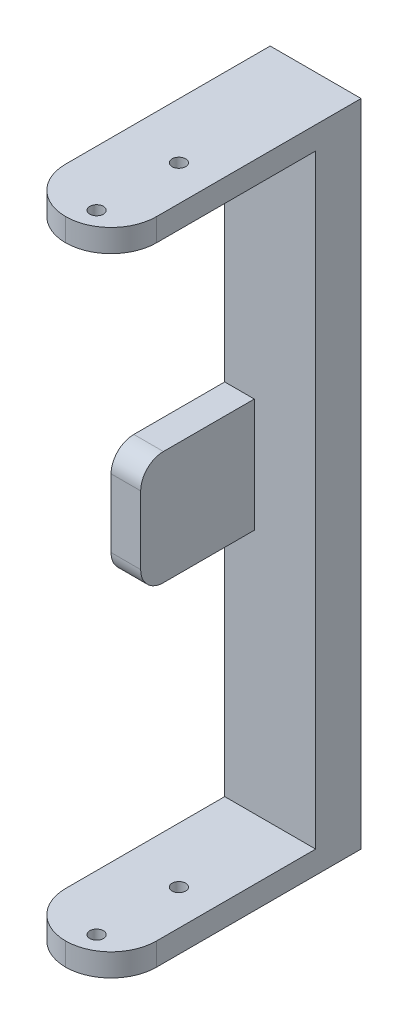
ISO-10303-21;
HEADER;
FILE_DESCRIPTION(('STEP AP214'),'2;1');
FILE_NAME('part.step','',(''),(''),'','','');
FILE_SCHEMA(('AUTOMOTIVE_DESIGN { 1 0 10303 214 1 1 1 1 }'));
ENDSEC;
DATA;
#1=APPLICATION_CONTEXT('core data for automotive mechanical design processes');
#2=APPLICATION_PROTOCOL_DEFINITION('international standard','automotive_design',2000,#1);
#3=PRODUCT_CONTEXT('',#1,'mechanical');
#4=PRODUCT('Part','Part','',(#3));
#5=PRODUCT_RELATED_PRODUCT_CATEGORY('part','',(#4));
#6=PRODUCT_DEFINITION_FORMATION('','',#4);
#7=PRODUCT_DEFINITION_CONTEXT('part definition',#1,'design');
#8=PRODUCT_DEFINITION('design','',#6,#7);
#9=PRODUCT_DEFINITION_SHAPE('','',#8);
#10=(LENGTH_UNIT() NAMED_UNIT(*) SI_UNIT(.MILLI.,.METRE.));
#11=(NAMED_UNIT(*) PLANE_ANGLE_UNIT() SI_UNIT($,.RADIAN.));
#12=(NAMED_UNIT(*) SI_UNIT($,.STERADIAN.) SOLID_ANGLE_UNIT());
#13=UNCERTAINTY_MEASURE_WITH_UNIT(LENGTH_MEASURE(1.E-05),#10,'distance_accuracy_value','');
#14=(GEOMETRIC_REPRESENTATION_CONTEXT(3) GLOBAL_UNCERTAINTY_ASSIGNED_CONTEXT((#13)) GLOBAL_UNIT_ASSIGNED_CONTEXT((#10,
#11,#12)) REPRESENTATION_CONTEXT('',''));
#15=CARTESIAN_POINT('',(0.,0.,0.));
#16=DIRECTION('',(0.,0.,1.));
#17=DIRECTION('',(1.,0.,0.));
#18=AXIS2_PLACEMENT_3D('',#15,#16,#17);
#19=CARTESIAN_POINT('',(0.,0.,10.));
#20=DIRECTION('',(0.,0.,1.));
#21=DIRECTION('',(1.,0.,0.));
#22=AXIS2_PLACEMENT_3D('',#19,#20,#21);
#23=PLANE('',#22);
#24=DIRECTION('',(0.,-1.,0.));
#25=VECTOR('',#24,1.);
#26=CARTESIAN_POINT('',(-20.,71.5,10.));
#27=LINE('',#26,#25);
#28=CARTESIAN_POINT('',(-20.,66.5,10.));
#29=VERTEX_POINT('',#28);
#30=CARTESIAN_POINT('',(-20.,12.5,10.));
#31=VERTEX_POINT('',#30);
#32=EDGE_CURVE('E220',#29,#31,#27,.T.);
#33=ORIENTED_EDGE('',*,*,#32,.T.);
#34=DIRECTION('',(-1.,0.,0.));
#35=VECTOR('',#34,1.);
#36=CARTESIAN_POINT('',(0.,12.5,10.));
#37=LINE('',#36,#35);
#38=CARTESIAN_POINT('',(-13.49,12.5,10.));
#39=VERTEX_POINT('',#38);
#40=EDGE_CURVE('E168',#39,#31,#37,.T.);
#41=ORIENTED_EDGE('',*,*,#40,.F.);
#42=DIRECTION('',(0.,-1.,0.));
#43=VECTOR('',#42,1.);
#44=CARTESIAN_POINT('',(-13.49,0.,10.));
#45=LINE('',#44,#43);
#46=CARTESIAN_POINT('',(-13.49,-12.5,10.));
#47=VERTEX_POINT('',#46);
#48=EDGE_CURVE('E152',#39,#47,#45,.T.);
#49=ORIENTED_EDGE('',*,*,#48,.T.);
#50=DIRECTION('',(-1.,0.,0.));
#51=VECTOR('',#50,1.);
#52=CARTESIAN_POINT('',(0.,-12.5,10.));
#53=LINE('',#52,#51);
#54=CARTESIAN_POINT('',(-20.,-12.5,10.));
#55=VERTEX_POINT('',#54);
#56=EDGE_CURVE('E165',#47,#55,#53,.T.);
#57=ORIENTED_EDGE('',*,*,#56,.T.);
#58=CARTESIAN_POINT('',(-20.,-66.5,10.));
#59=VERTEX_POINT('',#58);
#60=EDGE_CURVE('E223',#55,#59,#27,.T.);
#61=ORIENTED_EDGE('',*,*,#60,.T.);
#62=DIRECTION('',(1.,0.,0.));
#63=VECTOR('',#62,1.);
#64=CARTESIAN_POINT('',(0.,-66.5,10.));
#65=LINE('',#64,#63);
#66=CARTESIAN_POINT('',(0.,-66.5,10.));
#67=VERTEX_POINT('',#66);
#68=EDGE_CURVE('E203',#59,#67,#65,.T.);
#69=ORIENTED_EDGE('',*,*,#68,.T.);
#70=DIRECTION('',(0.,1.,0.));
#71=VECTOR('',#70,1.);
#72=CARTESIAN_POINT('',(0.,71.5,10.));
#73=LINE('',#72,#71);
#74=CARTESIAN_POINT('',(0.,66.5,10.));
#75=VERTEX_POINT('',#74);
#76=EDGE_CURVE('E222',#67,#75,#73,.T.);
#77=ORIENTED_EDGE('',*,*,#76,.T.);
#78=DIRECTION('',(1.,0.,0.));
#79=VECTOR('',#78,1.);
#80=CARTESIAN_POINT('',(0.,66.5,10.));
#81=LINE('',#80,#79);
#82=EDGE_CURVE('E212',#29,#75,#81,.T.);
#83=ORIENTED_EDGE('',*,*,#82,.F.);
#84=EDGE_LOOP('',(#33,#41,#49,#57,#61,#69,#77,#83));
#85=FACE_BOUND('',#84,.T.);
#86=ADVANCED_FACE('F35',(#85),#23,.T.);
#87=CARTESIAN_POINT('',(-20.,71.5,10.));
#88=DIRECTION('',(1.,0.,0.));
#89=DIRECTION('',(0.,0.,-1.));
#90=AXIS2_PLACEMENT_3D('',#87,#88,#89);
#91=PLANE('',#90);
#92=DIRECTION('',(0.,0.,-1.));
#93=VECTOR('',#92,1.);
#94=CARTESIAN_POINT('',(-20.,-12.5,35.));
#95=LINE('',#94,#93);
#96=CARTESIAN_POINT('',(-20.,-12.5,30.));
#97=VERTEX_POINT('',#96);
#98=EDGE_CURVE('E158',#97,#55,#95,.T.);
#99=ORIENTED_EDGE('',*,*,#98,.F.);
#100=CARTESIAN_POINT('',(-20.,-7.5,30.));
#101=DIRECTION('',(1.,0.,0.));
#102=DIRECTION('',(0.,0.,-1.));
#103=AXIS2_PLACEMENT_3D('',#100,#101,#102);
#104=CIRCLE('',#103,5.);
#105=CARTESIAN_POINT('',(-20.,-7.5,35.));
#106=VERTEX_POINT('',#105);
#107=EDGE_CURVE('E283',#97,#106,#104,.F.);
#108=ORIENTED_EDGE('',*,*,#107,.T.);
#109=DIRECTION('',(0.,-1.,0.));
#110=VECTOR('',#109,1.);
#111=CARTESIAN_POINT('',(-20.,0.,35.));
#112=LINE('',#111,#110);
#113=CARTESIAN_POINT('',(-20.,7.5,35.));
#114=VERTEX_POINT('',#113);
#115=EDGE_CURVE('E159',#114,#106,#112,.T.);
#116=ORIENTED_EDGE('',*,*,#115,.F.);
#117=CARTESIAN_POINT('',(-20.,7.5,30.));
#118=DIRECTION('',(1.,0.,0.));
#119=DIRECTION('',(0.,0.,-1.));
#120=AXIS2_PLACEMENT_3D('',#117,#118,#119);
#121=CIRCLE('',#120,5.);
#122=CARTESIAN_POINT('',(-20.,12.5,30.));
#123=VERTEX_POINT('',#122);
#124=EDGE_CURVE('E281',#114,#123,#121,.F.);
#125=ORIENTED_EDGE('',*,*,#124,.T.);
#126=DIRECTION('',(0.,0.,-1.));
#127=VECTOR('',#126,1.);
#128=CARTESIAN_POINT('',(-20.,12.5,35.));
#129=LINE('',#128,#127);
#130=EDGE_CURVE('E178',#123,#31,#129,.T.);
#131=ORIENTED_EDGE('',*,*,#130,.T.);
#132=ORIENTED_EDGE('',*,*,#32,.F.);
#133=DIRECTION('',(0.,0.,-1.));
#134=VECTOR('',#133,1.);
#135=CARTESIAN_POINT('',(-20.,66.5,55.));
#136=LINE('',#135,#134);
#137=CARTESIAN_POINT('',(-20.,66.5,45.));
#138=VERTEX_POINT('',#137);
#139=EDGE_CURVE('E217',#138,#29,#136,.T.);
#140=ORIENTED_EDGE('',*,*,#139,.F.);
#141=DIRECTION('',(0.,-1.,0.));
#142=VECTOR('',#141,1.);
#143=CARTESIAN_POINT('',(-20.,71.5,45.));
#144=LINE('',#143,#142);
#145=CARTESIAN_POINT('',(-20.,71.5,45.));
#146=VERTEX_POINT('',#145);
#147=EDGE_CURVE('E258',#138,#146,#144,.F.);
#148=ORIENTED_EDGE('',*,*,#147,.T.);
#149=DIRECTION('',(0.,0.,-1.));
#150=VECTOR('',#149,1.);
#151=CARTESIAN_POINT('',(-20.,71.5,10.));
#152=LINE('',#151,#150);
#153=CARTESIAN_POINT('',(-20.,71.5,0.));
#154=VERTEX_POINT('',#153);
#155=EDGE_CURVE('E226',#146,#154,#152,.T.);
#156=ORIENTED_EDGE('',*,*,#155,.T.);
#157=DIRECTION('',(0.,-1.,0.));
#158=VECTOR('',#157,1.);
#159=CARTESIAN_POINT('',(-20.,71.5,0.));
#160=LINE('',#159,#158);
#161=CARTESIAN_POINT('',(-20.,-71.5,0.));
#162=VERTEX_POINT('',#161);
#163=EDGE_CURVE('E219',#154,#162,#160,.T.);
#164=ORIENTED_EDGE('',*,*,#163,.T.);
#165=DIRECTION('',(0.,0.,-1.));
#166=VECTOR('',#165,1.);
#167=CARTESIAN_POINT('',(-20.,-71.5,10.));
#168=LINE('',#167,#166);
#169=CARTESIAN_POINT('',(-20.,-71.5,45.));
#170=VERTEX_POINT('',#169);
#171=EDGE_CURVE('E243',#170,#162,#168,.T.);
#172=ORIENTED_EDGE('',*,*,#171,.F.);
#173=DIRECTION('',(0.,-1.,0.));
#174=VECTOR('',#173,1.);
#175=CARTESIAN_POINT('',(-20.,-66.5,45.));
#176=LINE('',#175,#174);
#177=CARTESIAN_POINT('',(-20.,-66.5,45.));
#178=VERTEX_POINT('',#177);
#179=EDGE_CURVE('E261',#170,#178,#176,.F.);
#180=ORIENTED_EDGE('',*,*,#179,.T.);
#181=DIRECTION('',(0.,0.,-1.));
#182=VECTOR('',#181,1.);
#183=CARTESIAN_POINT('',(-20.,-66.5,55.));
#184=LINE('',#183,#182);
#185=EDGE_CURVE('E209',#178,#59,#184,.T.);
#186=ORIENTED_EDGE('',*,*,#185,.T.);
#187=ORIENTED_EDGE('',*,*,#60,.F.);
#188=EDGE_LOOP('',(#99,#108,#116,#125,#131,#132,#140,#148,#156,#164,#172,#180,#186,#187));
#189=FACE_BOUND('',#188,.T.);
#190=ADVANCED_FACE('F296',(#189),#91,.F.);
#191=CARTESIAN_POINT('',(-20.,-71.5,10.));
#192=DIRECTION('',(0.,1.,0.));
#193=DIRECTION('',(0.,0.,1.));
#194=AXIS2_PLACEMENT_3D('',#191,#192,#193);
#195=PLANE('',#194);
#196=CARTESIAN_POINT('',(-7.80000000000008,-71.5,32.2835836967569));
#197=DIRECTION('',(0.,1.,0.));
#198=DIRECTION('',(0.,0.,1.));
#199=AXIS2_PLACEMENT_3D('',#196,#197,#198);
#200=CIRCLE('',#199,1.5);
#201=CARTESIAN_POINT('',(-7.80000000000008,-71.5,33.7835836967569));
#202=VERTEX_POINT('',#201);
#203=EDGE_CURVE('E183',#202,#202,#200,.T.);
#204=ORIENTED_EDGE('',*,*,#203,.T.);
#205=EDGE_LOOP('',(#204));
#206=FACE_BOUND('',#205,.T.);
#207=CARTESIAN_POINT('',(-7.80000000000009,-71.5,50.383583696757));
#208=DIRECTION('',(0.,1.,0.));
#209=DIRECTION('',(0.,0.,1.));
#210=AXIS2_PLACEMENT_3D('',#207,#208,#209);
#211=CIRCLE('',#210,1.5);
#212=CARTESIAN_POINT('',(-7.80000000000009,-71.5,51.883583696757));
#213=VERTEX_POINT('',#212);
#214=EDGE_CURVE('E190',#213,#213,#211,.T.);
#215=ORIENTED_EDGE('',*,*,#214,.T.);
#216=EDGE_LOOP('',(#215));
#217=FACE_BOUND('',#216,.T.);
#218=DIRECTION('',(0.,0.,-1.));
#219=VECTOR('',#218,1.);
#220=CARTESIAN_POINT('',(0.,-71.5,10.));
#221=LINE('',#220,#219);
#222=CARTESIAN_POINT('',(0.,-71.5,45.));
#223=VERTEX_POINT('',#222);
#224=CARTESIAN_POINT('',(0.,-71.5,0.));
#225=VERTEX_POINT('',#224);
#226=EDGE_CURVE('E241',#223,#225,#221,.T.);
#227=ORIENTED_EDGE('',*,*,#226,.F.);
#228=CARTESIAN_POINT('',(-10.,-71.5,45.));
#229=DIRECTION('',(0.,1.,0.));
#230=DIRECTION('',(0.,0.,1.));
#231=AXIS2_PLACEMENT_3D('',#228,#229,#230);
#232=CIRCLE('',#231,10.);
#233=CARTESIAN_POINT('',(-10.,-71.5,55.));
#234=VERTEX_POINT('',#233);
#235=EDGE_CURVE('E256',#223,#234,#232,.F.);
#236=ORIENTED_EDGE('',*,*,#235,.T.);
#237=CARTESIAN_POINT('',(-10.,-71.5,45.));
#238=DIRECTION('',(0.,1.,0.));
#239=DIRECTION('',(0.,0.,1.));
#240=AXIS2_PLACEMENT_3D('',#237,#238,#239);
#241=CIRCLE('',#240,10.);
#242=EDGE_CURVE('E254',#234,#170,#241,.F.);
#243=ORIENTED_EDGE('',*,*,#242,.T.);
#244=ORIENTED_EDGE('',*,*,#171,.T.);
#245=DIRECTION('',(1.,0.,0.));
#246=VECTOR('',#245,1.);
#247=CARTESIAN_POINT('',(-20.,-71.5,0.));
#248=LINE('',#247,#246);
#249=EDGE_CURVE('E229',#162,#225,#248,.T.);
#250=ORIENTED_EDGE('',*,*,#249,.T.);
#251=EDGE_LOOP('',(#227,#236,#243,#244,#250));
#252=FACE_BOUND('',#251,.T.);
#253=ADVANCED_FACE('F313',(#206,#217,#252),#195,.F.);
#254=CARTESIAN_POINT('',(0.,71.5,10.));
#255=DIRECTION('',(-1.,0.,0.));
#256=DIRECTION('',(0.,0.,1.));
#257=AXIS2_PLACEMENT_3D('',#254,#255,#256);
#258=PLANE('',#257);
#259=DIRECTION('',(0.,0.,-1.));
#260=VECTOR('',#259,1.);
#261=CARTESIAN_POINT('',(0.,-66.5,55.));
#262=LINE('',#261,#260);
#263=CARTESIAN_POINT('',(0.,-66.5,45.));
#264=VERTEX_POINT('',#263);
#265=EDGE_CURVE('E206',#264,#67,#262,.T.);
#266=ORIENTED_EDGE('',*,*,#265,.F.);
#267=DIRECTION('',(0.,1.,0.));
#268=VECTOR('',#267,1.);
#269=CARTESIAN_POINT('',(0.,-71.5,45.));
#270=LINE('',#269,#268);
#271=EDGE_CURVE('E251',#264,#223,#270,.F.);
#272=ORIENTED_EDGE('',*,*,#271,.T.);
#273=ORIENTED_EDGE('',*,*,#226,.T.);
#274=DIRECTION('',(0.,1.,0.));
#275=VECTOR('',#274,1.);
#276=CARTESIAN_POINT('',(0.,71.5,0.));
#277=LINE('',#276,#275);
#278=CARTESIAN_POINT('',(0.,71.5,0.));
#279=VERTEX_POINT('',#278);
#280=EDGE_CURVE('E232',#225,#279,#277,.T.);
#281=ORIENTED_EDGE('',*,*,#280,.T.);
#282=DIRECTION('',(0.,0.,-1.));
#283=VECTOR('',#282,1.);
#284=CARTESIAN_POINT('',(0.,71.5,10.));
#285=LINE('',#284,#283);
#286=CARTESIAN_POINT('',(0.,71.5,45.));
#287=VERTEX_POINT('',#286);
#288=EDGE_CURVE('E239',#287,#279,#285,.T.);
#289=ORIENTED_EDGE('',*,*,#288,.F.);
#290=DIRECTION('',(0.,1.,0.));
#291=VECTOR('',#290,1.);
#292=CARTESIAN_POINT('',(0.,66.5,45.));
#293=LINE('',#292,#291);
#294=CARTESIAN_POINT('',(0.,66.5,45.));
#295=VERTEX_POINT('',#294);
#296=EDGE_CURVE('E249',#287,#295,#293,.F.);
#297=ORIENTED_EDGE('',*,*,#296,.T.);
#298=DIRECTION('',(0.,0.,-1.));
#299=VECTOR('',#298,1.);
#300=CARTESIAN_POINT('',(0.,66.5,55.));
#301=LINE('',#300,#299);
#302=EDGE_CURVE('E215',#295,#75,#301,.T.);
#303=ORIENTED_EDGE('',*,*,#302,.T.);
#304=ORIENTED_EDGE('',*,*,#76,.F.);
#305=EDGE_LOOP('',(#266,#272,#273,#281,#289,#297,#303,#304));
#306=FACE_BOUND('',#305,.T.);
#307=ADVANCED_FACE('F326',(#306),#258,.F.);
#308=CARTESIAN_POINT('',(-20.,71.5,10.));
#309=DIRECTION('',(0.,-1.,0.));
#310=DIRECTION('',(0.,0.,-1.));
#311=AXIS2_PLACEMENT_3D('',#308,#309,#310);
#312=PLANE('',#311);
#313=CARTESIAN_POINT('',(-7.80000000000008,71.5,32.2835836967569));
#314=DIRECTION('',(0.,1.,0.));
#315=DIRECTION('',(0.,0.,1.));
#316=AXIS2_PLACEMENT_3D('',#313,#314,#315);
#317=CIRCLE('',#316,1.5);
#318=CARTESIAN_POINT('',(-7.80000000000008,71.5,33.7835836967569));
#319=VERTEX_POINT('',#318);
#320=EDGE_CURVE('E187',#319,#319,#317,.T.);
#321=ORIENTED_EDGE('',*,*,#320,.F.);
#322=EDGE_LOOP('',(#321));
#323=FACE_BOUND('',#322,.T.);
#324=CARTESIAN_POINT('',(-7.80000000000009,71.5,50.383583696757));
#325=DIRECTION('',(0.,1.,0.));
#326=DIRECTION('',(0.,0.,1.));
#327=AXIS2_PLACEMENT_3D('',#324,#325,#326);
#328=CIRCLE('',#327,1.5);
#329=CARTESIAN_POINT('',(-7.80000000000009,71.5,51.883583696757));
#330=VERTEX_POINT('',#329);
#331=EDGE_CURVE('E182',#330,#330,#328,.T.);
#332=ORIENTED_EDGE('',*,*,#331,.F.);
#333=EDGE_LOOP('',(#332));
#334=FACE_BOUND('',#333,.T.);
#335=ORIENTED_EDGE('',*,*,#155,.F.);
#336=CARTESIAN_POINT('',(-10.,71.5,45.));
#337=DIRECTION('',(0.,-1.,0.));
#338=DIRECTION('',(0.,0.,-1.));
#339=AXIS2_PLACEMENT_3D('',#336,#337,#338);
#340=CIRCLE('',#339,10.);
#341=CARTESIAN_POINT('',(-10.,71.5,55.));
#342=VERTEX_POINT('',#341);
#343=EDGE_CURVE('E269',#146,#342,#340,.F.);
#344=ORIENTED_EDGE('',*,*,#343,.T.);
#345=CARTESIAN_POINT('',(-10.,71.5,45.));
#346=DIRECTION('',(0.,-1.,0.));
#347=DIRECTION('',(0.,0.,-1.));
#348=AXIS2_PLACEMENT_3D('',#345,#346,#347);
#349=CIRCLE('',#348,10.);
#350=EDGE_CURVE('E267',#342,#287,#349,.F.);
#351=ORIENTED_EDGE('',*,*,#350,.T.);
#352=ORIENTED_EDGE('',*,*,#288,.T.);
#353=DIRECTION('',(-1.,0.,0.));
#354=VECTOR('',#353,1.);
#355=CARTESIAN_POINT('',(-20.,71.5,0.));
#356=LINE('',#355,#354);
#357=EDGE_CURVE('E235',#279,#154,#356,.T.);
#358=ORIENTED_EDGE('',*,*,#357,.T.);
#359=EDGE_LOOP('',(#335,#344,#351,#352,#358));
#360=FACE_BOUND('',#359,.T.);
#361=ADVANCED_FACE('F322',(#323,#334,#360),#312,.F.);
#362=CARTESIAN_POINT('',(0.,0.,0.));
#363=DIRECTION('',(0.,0.,1.));
#364=DIRECTION('',(1.,0.,0.));
#365=AXIS2_PLACEMENT_3D('',#362,#363,#364);
#366=PLANE('',#365);
#367=ORIENTED_EDGE('',*,*,#163,.F.);
#368=ORIENTED_EDGE('',*,*,#357,.F.);
#369=ORIENTED_EDGE('',*,*,#280,.F.);
#370=ORIENTED_EDGE('',*,*,#249,.F.);
#371=EDGE_LOOP('',(#367,#368,#369,#370));
#372=FACE_BOUND('',#371,.T.);
#373=ADVANCED_FACE('F319',(#372),#366,.F.);
#374=CARTESIAN_POINT('',(0.,66.5,55.));
#375=DIRECTION('',(0.,1.,0.));
#376=DIRECTION('',(0.,0.,1.));
#377=AXIS2_PLACEMENT_3D('',#374,#375,#376);
#378=PLANE('',#377);
#379=CARTESIAN_POINT('',(-7.80000000000008,66.5,32.2835836967569));
#380=DIRECTION('',(0.,1.,0.));
#381=DIRECTION('',(0.,0.,1.));
#382=AXIS2_PLACEMENT_3D('',#379,#380,#381);
#383=CIRCLE('',#382,1.5);
#384=CARTESIAN_POINT('',(-7.80000000000008,66.5,33.7835836967569));
#385=VERTEX_POINT('',#384);
#386=EDGE_CURVE('E199',#385,#385,#383,.T.);
#387=ORIENTED_EDGE('',*,*,#386,.T.);
#388=EDGE_LOOP('',(#387));
#389=FACE_BOUND('',#388,.T.);
#390=CARTESIAN_POINT('',(-7.80000000000009,66.5,50.383583696757));
#391=DIRECTION('',(0.,1.,0.));
#392=DIRECTION('',(0.,0.,1.));
#393=AXIS2_PLACEMENT_3D('',#390,#391,#392);
#394=CIRCLE('',#393,1.5);
#395=CARTESIAN_POINT('',(-7.80000000000009,66.5,51.883583696757));
#396=VERTEX_POINT('',#395);
#397=EDGE_CURVE('E195',#396,#396,#394,.T.);
#398=ORIENTED_EDGE('',*,*,#397,.T.);
#399=EDGE_LOOP('',(#398));
#400=FACE_BOUND('',#399,.T.);
#401=CARTESIAN_POINT('',(-10.,66.5,45.));
#402=DIRECTION('',(0.,1.,0.));
#403=DIRECTION('',(0.,0.,1.));
#404=AXIS2_PLACEMENT_3D('',#401,#402,#403);
#405=CIRCLE('',#404,10.);
#406=CARTESIAN_POINT('',(-10.,66.5,55.));
#407=VERTEX_POINT('',#406);
#408=EDGE_CURVE('E263',#295,#407,#405,.F.);
#409=ORIENTED_EDGE('',*,*,#408,.T.);
#410=CARTESIAN_POINT('',(-10.,66.5,45.));
#411=DIRECTION('',(0.,1.,0.));
#412=DIRECTION('',(0.,0.,1.));
#413=AXIS2_PLACEMENT_3D('',#410,#411,#412);
#414=CIRCLE('',#413,10.);
#415=EDGE_CURVE('E265',#407,#138,#414,.F.);
#416=ORIENTED_EDGE('',*,*,#415,.T.);
#417=ORIENTED_EDGE('',*,*,#139,.T.);
#418=ORIENTED_EDGE('',*,*,#82,.T.);
#419=ORIENTED_EDGE('',*,*,#302,.F.);
#420=EDGE_LOOP('',(#409,#416,#417,#418,#419));
#421=FACE_BOUND('',#420,.T.);
#422=ADVANCED_FACE('F317',(#389,#400,#421),#378,.F.);
#423=CARTESIAN_POINT('',(0.,-66.5,55.));
#424=DIRECTION('',(0.,1.,0.));
#425=DIRECTION('',(0.,0.,1.));
#426=AXIS2_PLACEMENT_3D('',#423,#424,#425);
#427=PLANE('',#426);
#428=CARTESIAN_POINT('',(-7.80000000000008,-66.5,32.2835836967569));
#429=DIRECTION('',(0.,1.,0.));
#430=DIRECTION('',(0.,0.,1.));
#431=AXIS2_PLACEMENT_3D('',#428,#429,#430);
#432=CIRCLE('',#431,1.5);
#433=CARTESIAN_POINT('',(-7.80000000000008,-66.5,33.7835836967569));
#434=VERTEX_POINT('',#433);
#435=EDGE_CURVE('E198',#434,#434,#432,.T.);
#436=ORIENTED_EDGE('',*,*,#435,.F.);
#437=EDGE_LOOP('',(#436));
#438=FACE_BOUND('',#437,.T.);
#439=CARTESIAN_POINT('',(-7.80000000000009,-66.5,50.383583696757));
#440=DIRECTION('',(0.,1.,0.));
#441=DIRECTION('',(0.,0.,1.));
#442=AXIS2_PLACEMENT_3D('',#439,#440,#441);
#443=CIRCLE('',#442,1.5);
#444=CARTESIAN_POINT('',(-7.80000000000009,-66.5,51.883583696757));
#445=VERTEX_POINT('',#444);
#446=EDGE_CURVE('E186',#445,#445,#443,.T.);
#447=ORIENTED_EDGE('',*,*,#446,.F.);
#448=EDGE_LOOP('',(#447));
#449=FACE_BOUND('',#448,.T.);
#450=CARTESIAN_POINT('',(-10.,-66.5,45.));
#451=DIRECTION('',(0.,1.,0.));
#452=DIRECTION('',(0.,0.,1.));
#453=AXIS2_PLACEMENT_3D('',#450,#451,#452);
#454=CIRCLE('',#453,10.);
#455=CARTESIAN_POINT('',(-10.,-66.5,55.));
#456=VERTEX_POINT('',#455);
#457=EDGE_CURVE('E245',#178,#456,#454,.T.);
#458=ORIENTED_EDGE('',*,*,#457,.T.);
#459=CARTESIAN_POINT('',(-10.,-66.5,45.));
#460=DIRECTION('',(0.,1.,0.));
#461=DIRECTION('',(0.,0.,1.));
#462=AXIS2_PLACEMENT_3D('',#459,#460,#461);
#463=CIRCLE('',#462,10.);
#464=EDGE_CURVE('E247',#456,#264,#463,.T.);
#465=ORIENTED_EDGE('',*,*,#464,.T.);
#466=ORIENTED_EDGE('',*,*,#265,.T.);
#467=ORIENTED_EDGE('',*,*,#68,.F.);
#468=ORIENTED_EDGE('',*,*,#185,.F.);
#469=EDGE_LOOP('',(#458,#465,#466,#467,#468));
#470=FACE_BOUND('',#469,.T.);
#471=ADVANCED_FACE('F342',(#438,#449,#470),#427,.T.);
#472=CARTESIAN_POINT('',(-10.,0.,45.));
#473=DIRECTION('',(0.,1.,0.));
#474=DIRECTION('',(0.,0.,1.));
#475=AXIS2_PLACEMENT_3D('',#472,#473,#474);
#476=CYLINDRICAL_SURFACE('',#475,10.);
#477=ORIENTED_EDGE('',*,*,#179,.F.);
#478=ORIENTED_EDGE('',*,*,#242,.F.);
#479=DIRECTION('',(0.,-1.,0.));
#480=VECTOR('',#479,1.);
#481=CARTESIAN_POINT('',(-10.,-71.5,55.));
#482=LINE('',#481,#480);
#483=EDGE_CURVE('E207',#456,#234,#482,.T.);
#484=ORIENTED_EDGE('',*,*,#483,.F.);
#485=ORIENTED_EDGE('',*,*,#457,.F.);
#486=EDGE_LOOP('',(#477,#478,#484,#485));
#487=FACE_BOUND('',#486,.T.);
#488=ADVANCED_FACE('F338',(#487),#476,.T.);
#489=CARTESIAN_POINT('',(-10.,0.,45.));
#490=DIRECTION('',(0.,-1.,0.));
#491=DIRECTION('',(0.,0.,-1.));
#492=AXIS2_PLACEMENT_3D('',#489,#490,#491);
#493=CYLINDRICAL_SURFACE('',#492,10.);
#494=ORIENTED_EDGE('',*,*,#235,.F.);
#495=ORIENTED_EDGE('',*,*,#271,.F.);
#496=ORIENTED_EDGE('',*,*,#464,.F.);
#497=ORIENTED_EDGE('',*,*,#483,.T.);
#498=EDGE_LOOP('',(#494,#495,#496,#497));
#499=FACE_BOUND('',#498,.T.);
#500=ADVANCED_FACE('F334',(#499),#493,.T.);
#501=CARTESIAN_POINT('',(-10.,0.,45.));
#502=DIRECTION('',(0.,-1.,0.));
#503=DIRECTION('',(0.,0.,-1.));
#504=AXIS2_PLACEMENT_3D('',#501,#502,#503);
#505=CYLINDRICAL_SURFACE('',#504,10.);
#506=ORIENTED_EDGE('',*,*,#296,.F.);
#507=ORIENTED_EDGE('',*,*,#350,.F.);
#508=DIRECTION('',(0.,1.,0.));
#509=VECTOR('',#508,1.);
#510=CARTESIAN_POINT('',(-10.,71.5,55.));
#511=LINE('',#510,#509);
#512=EDGE_CURVE('E202',#407,#342,#511,.T.);
#513=ORIENTED_EDGE('',*,*,#512,.F.);
#514=ORIENTED_EDGE('',*,*,#408,.F.);
#515=EDGE_LOOP('',(#506,#507,#513,#514));
#516=FACE_BOUND('',#515,.T.);
#517=ADVANCED_FACE('F337',(#516),#505,.T.);
#518=CARTESIAN_POINT('',(-10.,0.,45.));
#519=DIRECTION('',(0.,1.,0.));
#520=DIRECTION('',(0.,0.,1.));
#521=AXIS2_PLACEMENT_3D('',#518,#519,#520);
#522=CYLINDRICAL_SURFACE('',#521,10.);
#523=ORIENTED_EDGE('',*,*,#343,.F.);
#524=ORIENTED_EDGE('',*,*,#147,.F.);
#525=ORIENTED_EDGE('',*,*,#415,.F.);
#526=ORIENTED_EDGE('',*,*,#512,.T.);
#527=EDGE_LOOP('',(#523,#524,#525,#526));
#528=FACE_BOUND('',#527,.T.);
#529=ADVANCED_FACE('F344',(#528),#522,.T.);
#530=CARTESIAN_POINT('',(-7.80000000000009,-71.5,50.383583696757));
#531=DIRECTION('',(0.,1.,0.));
#532=DIRECTION('',(0.,0.,1.));
#533=AXIS2_PLACEMENT_3D('',#530,#531,#532);
#534=CYLINDRICAL_SURFACE('',#533,1.5);
#535=ORIENTED_EDGE('',*,*,#446,.T.);
#536=EDGE_LOOP('',(#535));
#537=FACE_BOUND('',#536,.T.);
#538=ORIENTED_EDGE('',*,*,#214,.F.);
#539=EDGE_LOOP('',(#538));
#540=FACE_BOUND('',#539,.T.);
#541=ADVANCED_FACE('F347',(#537,#540),#534,.F.);
#542=CARTESIAN_POINT('',(-7.80000000000008,-71.5,32.2835836967569));
#543=DIRECTION('',(0.,1.,0.));
#544=DIRECTION('',(0.,0.,1.));
#545=AXIS2_PLACEMENT_3D('',#542,#543,#544);
#546=CYLINDRICAL_SURFACE('',#545,1.5);
#547=ORIENTED_EDGE('',*,*,#435,.T.);
#548=EDGE_LOOP('',(#547));
#549=FACE_BOUND('',#548,.T.);
#550=ORIENTED_EDGE('',*,*,#203,.F.);
#551=EDGE_LOOP('',(#550));
#552=FACE_BOUND('',#551,.T.);
#553=ADVANCED_FACE('F402',(#549,#552),#546,.F.);
#554=ORIENTED_EDGE('',*,*,#331,.T.);
#555=EDGE_LOOP('',(#554));
#556=FACE_BOUND('',#555,.T.);
#557=ORIENTED_EDGE('',*,*,#397,.F.);
#558=EDGE_LOOP('',(#557));
#559=FACE_BOUND('',#558,.T.);
#560=ADVANCED_FACE('F400',(#556,#559),#534,.F.);
#561=ORIENTED_EDGE('',*,*,#320,.T.);
#562=EDGE_LOOP('',(#561));
#563=FACE_BOUND('',#562,.T.);
#564=ORIENTED_EDGE('',*,*,#386,.F.);
#565=EDGE_LOOP('',(#564));
#566=FACE_BOUND('',#565,.T.);
#567=ADVANCED_FACE('F306',(#563,#566),#546,.F.);
#568=CARTESIAN_POINT('',(-13.49,0.,35.));
#569=DIRECTION('',(1.,0.,0.));
#570=DIRECTION('',(0.,1.,0.));
#571=AXIS2_PLACEMENT_3D('',#568,#569,#570);
#572=PLANE('',#571);
#573=DIRECTION('',(0.,-1.,0.));
#574=VECTOR('',#573,1.);
#575=CARTESIAN_POINT('',(-13.49,0.,35.));
#576=LINE('',#575,#574);
#577=CARTESIAN_POINT('',(-13.49,7.5,35.));
#578=VERTEX_POINT('',#577);
#579=CARTESIAN_POINT('',(-13.49,-7.5,35.));
#580=VERTEX_POINT('',#579);
#581=EDGE_CURVE('E172',#578,#580,#576,.T.);
#582=ORIENTED_EDGE('',*,*,#581,.T.);
#583=CARTESIAN_POINT('',(-13.49,-7.5,30.));
#584=DIRECTION('',(1.,0.,0.));
#585=DIRECTION('',(0.,1.,0.));
#586=AXIS2_PLACEMENT_3D('',#583,#584,#585);
#587=CIRCLE('',#586,5.);
#588=CARTESIAN_POINT('',(-13.49,-12.5,30.));
#589=VERTEX_POINT('',#588);
#590=EDGE_CURVE('E43',#580,#589,#587,.T.);
#591=ORIENTED_EDGE('',*,*,#590,.T.);
#592=DIRECTION('',(0.,0.,-1.));
#593=VECTOR('',#592,1.);
#594=CARTESIAN_POINT('',(-13.49,-12.5,35.));
#595=LINE('',#594,#593);
#596=EDGE_CURVE('E149',#589,#47,#595,.T.);
#597=ORIENTED_EDGE('',*,*,#596,.T.);
#598=ORIENTED_EDGE('',*,*,#48,.F.);
#599=DIRECTION('',(0.,0.,-1.));
#600=VECTOR('',#599,1.);
#601=CARTESIAN_POINT('',(-13.49,12.5,35.));
#602=LINE('',#601,#600);
#603=CARTESIAN_POINT('',(-13.49,12.5,30.));
#604=VERTEX_POINT('',#603);
#605=EDGE_CURVE('E180',#604,#39,#602,.T.);
#606=ORIENTED_EDGE('',*,*,#605,.F.);
#607=CARTESIAN_POINT('',(-13.49,7.5,30.));
#608=DIRECTION('',(1.,0.,0.));
#609=DIRECTION('',(0.,1.,0.));
#610=AXIS2_PLACEMENT_3D('',#607,#608,#609);
#611=CIRCLE('',#610,5.);
#612=EDGE_CURVE('E289',#604,#578,#611,.T.);
#613=ORIENTED_EDGE('',*,*,#612,.T.);
#614=EDGE_LOOP('',(#582,#591,#597,#598,#606,#613));
#615=FACE_BOUND('',#614,.T.);
#616=ADVANCED_FACE('F151',(#615),#572,.T.);
#617=CARTESIAN_POINT('',(0.,12.5,35.));
#618=DIRECTION('',(0.,-1.,0.));
#619=DIRECTION('',(1.,0.,0.));
#620=AXIS2_PLACEMENT_3D('',#617,#618,#619);
#621=PLANE('',#620);
#622=ORIENTED_EDGE('',*,*,#130,.F.);
#623=DIRECTION('',(-1.,0.,0.));
#624=VECTOR('',#623,1.);
#625=CARTESIAN_POINT('',(-13.49,12.5,30.));
#626=LINE('',#625,#624);
#627=EDGE_CURVE('E11',#123,#604,#626,.F.);
#628=ORIENTED_EDGE('',*,*,#627,.T.);
#629=ORIENTED_EDGE('',*,*,#605,.T.);
#630=ORIENTED_EDGE('',*,*,#40,.T.);
#631=EDGE_LOOP('',(#622,#628,#629,#630));
#632=FACE_BOUND('',#631,.T.);
#633=ADVANCED_FACE('F298',(#632),#621,.F.);
#634=CARTESIAN_POINT('',(0.,-12.5,35.));
#635=DIRECTION('',(0.,-1.,0.));
#636=DIRECTION('',(0.,0.,-1.));
#637=AXIS2_PLACEMENT_3D('',#634,#635,#636);
#638=PLANE('',#637);
#639=ORIENTED_EDGE('',*,*,#596,.F.);
#640=DIRECTION('',(-1.,0.,0.));
#641=VECTOR('',#640,1.);
#642=CARTESIAN_POINT('',(0.,-12.5,30.));
#643=LINE('',#642,#641);
#644=EDGE_CURVE('E271',#589,#97,#643,.T.);
#645=ORIENTED_EDGE('',*,*,#644,.T.);
#646=ORIENTED_EDGE('',*,*,#98,.T.);
#647=ORIENTED_EDGE('',*,*,#56,.F.);
#648=EDGE_LOOP('',(#639,#645,#646,#647));
#649=FACE_BOUND('',#648,.T.);
#650=ADVANCED_FACE('F170',(#649),#638,.T.);
#651=CARTESIAN_POINT('',(0.,0.,35.));
#652=DIRECTION('',(0.,0.,1.));
#653=DIRECTION('',(1.,0.,0.));
#654=AXIS2_PLACEMENT_3D('',#651,#652,#653);
#655=PLANE('',#654);
#656=ORIENTED_EDGE('',*,*,#115,.T.);
#657=DIRECTION('',(-1.,0.,0.));
#658=VECTOR('',#657,1.);
#659=CARTESIAN_POINT('',(0.,-7.5,35.));
#660=LINE('',#659,#658);
#661=EDGE_CURVE('E56',#106,#580,#660,.F.);
#662=ORIENTED_EDGE('',*,*,#661,.T.);
#663=ORIENTED_EDGE('',*,*,#581,.F.);
#664=DIRECTION('',(-1.,0.,0.));
#665=VECTOR('',#664,1.);
#666=CARTESIAN_POINT('',(-20.,7.5,35.));
#667=LINE('',#666,#665);
#668=EDGE_CURVE('E285',#578,#114,#667,.T.);
#669=ORIENTED_EDGE('',*,*,#668,.T.);
#670=EDGE_LOOP('',(#656,#662,#663,#669));
#671=FACE_BOUND('',#670,.T.);
#672=ADVANCED_FACE('F293',(#671),#655,.T.);
#673=CARTESIAN_POINT('',(0.,-7.5,30.));
#674=DIRECTION('',(-1.,0.,0.));
#675=DIRECTION('',(0.,0.,1.));
#676=AXIS2_PLACEMENT_3D('',#673,#674,#675);
#677=CYLINDRICAL_SURFACE('',#676,5.);
#678=ORIENTED_EDGE('',*,*,#590,.F.);
#679=ORIENTED_EDGE('',*,*,#661,.F.);
#680=ORIENTED_EDGE('',*,*,#107,.F.);
#681=ORIENTED_EDGE('',*,*,#644,.F.);
#682=EDGE_LOOP('',(#678,#679,#680,#681));
#683=FACE_BOUND('',#682,.T.);
#684=ADVANCED_FACE('F351',(#683),#677,.T.);
#685=CARTESIAN_POINT('',(0.,7.50000000000001,30.));
#686=DIRECTION('',(1.,0.,0.));
#687=DIRECTION('',(0.,1.,0.));
#688=AXIS2_PLACEMENT_3D('',#685,#686,#687);
#689=CYLINDRICAL_SURFACE('',#688,5.);
#690=ORIENTED_EDGE('',*,*,#612,.F.);
#691=ORIENTED_EDGE('',*,*,#627,.F.);
#692=ORIENTED_EDGE('',*,*,#124,.F.);
#693=ORIENTED_EDGE('',*,*,#668,.F.);
#694=EDGE_LOOP('',(#690,#691,#692,#693));
#695=FACE_BOUND('',#694,.T.);
#696=ADVANCED_FACE('F37',(#695),#689,.T.);
#697=CLOSED_SHELL('',(#86,#190,#253,#307,#361,#373,#422,#471,#488,#500,#517,#529,#541,#553,#560,
#567,#616,#633,#650,#672,#684,#696));
#698=MANIFOLD_SOLID_BREP('B2',#697);
#699=ADVANCED_BREP_SHAPE_REPRESENTATION('',(#18,#698),#14);
#700=SHAPE_DEFINITION_REPRESENTATION(#9,#699);
ENDSEC;
END-ISO-10303-21;
